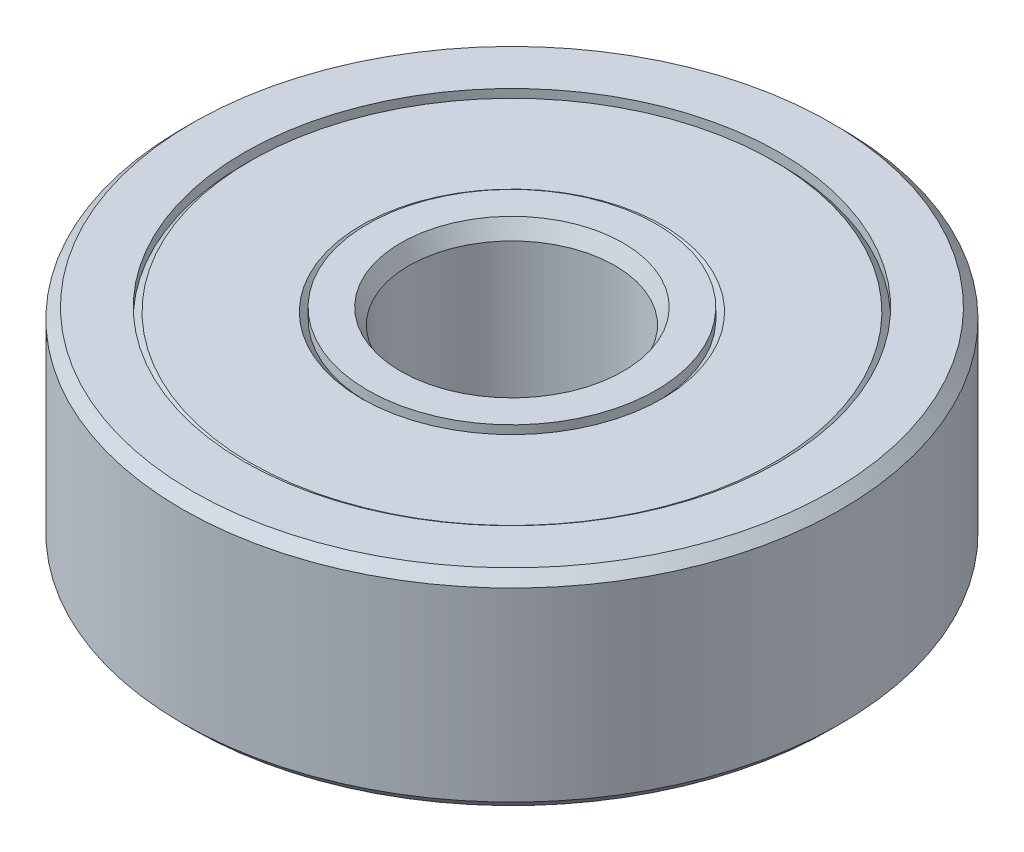
ISO-10303-21;
HEADER;
FILE_DESCRIPTION(('STEP AP214'),'2;1');
FILE_NAME('part.step','',(''),(''),'','','');
FILE_SCHEMA(('AUTOMOTIVE_DESIGN { 1 0 10303 214 1 1 1 1 }'));
ENDSEC;
DATA;
#1=APPLICATION_CONTEXT('core data for automotive mechanical design processes');
#2=APPLICATION_PROTOCOL_DEFINITION('international standard','automotive_design',2000,#1);
#3=PRODUCT_CONTEXT('',#1,'mechanical');
#4=PRODUCT('Part','Part','',(#3));
#5=PRODUCT_RELATED_PRODUCT_CATEGORY('part','',(#4));
#6=PRODUCT_DEFINITION_FORMATION('','',#4);
#7=PRODUCT_DEFINITION_CONTEXT('part definition',#1,'design');
#8=PRODUCT_DEFINITION('design','',#6,#7);
#9=PRODUCT_DEFINITION_SHAPE('','',#8);
#10=(LENGTH_UNIT() NAMED_UNIT(*) SI_UNIT(.MILLI.,.METRE.));
#11=(NAMED_UNIT(*) PLANE_ANGLE_UNIT() SI_UNIT($,.RADIAN.));
#12=(NAMED_UNIT(*) SI_UNIT($,.STERADIAN.) SOLID_ANGLE_UNIT());
#13=UNCERTAINTY_MEASURE_WITH_UNIT(LENGTH_MEASURE(1.E-05),#10,'distance_accuracy_value','');
#14=(GEOMETRIC_REPRESENTATION_CONTEXT(3) GLOBAL_UNCERTAINTY_ASSIGNED_CONTEXT((#13)) GLOBAL_UNIT_ASSIGNED_CONTEXT((#10,
#11,#12)) REPRESENTATION_CONTEXT('',''));
#15=CARTESIAN_POINT('',(0.,0.,0.));
#16=DIRECTION('',(0.,0.,1.));
#17=DIRECTION('',(1.,0.,0.));
#18=AXIS2_PLACEMENT_3D('',#15,#16,#17);
#19=CARTESIAN_POINT('',(0.,4.9,0.));
#20=DIRECTION('',(0.,-1.,0.));
#21=DIRECTION('',(0.,0.,-1.));
#22=AXIS2_PLACEMENT_3D('',#19,#20,#21);
#23=CYLINDRICAL_SURFACE('',#22,3.5);
#24=CARTESIAN_POINT('',(0.,0.250000000000004,0.));
#25=DIRECTION('',(0.,1.,0.));
#26=DIRECTION('',(0.,0.,1.));
#27=AXIS2_PLACEMENT_3D('',#24,#25,#26);
#28=CIRCLE('',#27,3.5);
#29=CARTESIAN_POINT('',(0.,0.250000000000004,3.5));
#30=VERTEX_POINT('',#29);
#31=EDGE_CURVE('E58',#30,#30,#28,.F.);
#32=ORIENTED_EDGE('',*,*,#31,.T.);
#33=EDGE_LOOP('',(#32));
#34=FACE_BOUND('',#33,.T.);
#35=CARTESIAN_POINT('',(0.,4.75,0.));
#36=DIRECTION('',(0.,1.,0.));
#37=DIRECTION('',(0.,0.,1.));
#38=AXIS2_PLACEMENT_3D('',#35,#36,#37);
#39=CIRCLE('',#38,3.5);
#40=CARTESIAN_POINT('',(0.,4.75,3.5));
#41=VERTEX_POINT('',#40);
#42=EDGE_CURVE('E62',#41,#41,#39,.T.);
#43=ORIENTED_EDGE('',*,*,#42,.T.);
#44=EDGE_LOOP('',(#43));
#45=FACE_BOUND('',#44,.T.);
#46=ADVANCED_FACE('F47',(#34,#45),#23,.F.);
#47=CARTESIAN_POINT('',(0.,4.9,0.));
#48=DIRECTION('',(0.,-1.,0.));
#49=DIRECTION('',(0.,0.,-1.));
#50=AXIS2_PLACEMENT_3D('',#47,#48,#49);
#51=CYLINDRICAL_SURFACE('',#50,6.5);
#52=CARTESIAN_POINT('',(0.,0.250000000000003,0.));
#53=DIRECTION('',(0.,1.,0.));
#54=DIRECTION('',(0.,0.,1.));
#55=AXIS2_PLACEMENT_3D('',#52,#53,#54);
#56=CIRCLE('',#55,6.5);
#57=CARTESIAN_POINT('',(0.,0.250000000000003,6.5));
#58=VERTEX_POINT('',#57);
#59=EDGE_CURVE('E73',#58,#58,#56,.T.);
#60=ORIENTED_EDGE('',*,*,#59,.T.);
#61=EDGE_LOOP('',(#60));
#62=FACE_BOUND('',#61,.T.);
#63=CARTESIAN_POINT('',(0.,4.75,0.));
#64=DIRECTION('',(0.,1.,0.));
#65=DIRECTION('',(0.,0.,1.));
#66=AXIS2_PLACEMENT_3D('',#63,#64,#65);
#67=CIRCLE('',#66,6.5);
#68=CARTESIAN_POINT('',(0.,4.75,6.5));
#69=VERTEX_POINT('',#68);
#70=EDGE_CURVE('E76',#69,#69,#67,.F.);
#71=ORIENTED_EDGE('',*,*,#70,.T.);
#72=EDGE_LOOP('',(#71));
#73=FACE_BOUND('',#72,.T.);
#74=ADVANCED_FACE('F80',(#62,#73),#51,.T.);
#75=CARTESIAN_POINT('',(0.,4.9,0.));
#76=DIRECTION('',(0.,1.,0.));
#77=DIRECTION('',(0.,0.,1.));
#78=AXIS2_PLACEMENT_3D('',#75,#76,#77);
#79=PLANE('',#78);
#80=CARTESIAN_POINT('',(0.,4.9,0.));
#81=DIRECTION('',(0.,1.,0.));
#82=DIRECTION('',(0.,0.,1.));
#83=AXIS2_PLACEMENT_3D('',#80,#81,#82);
#84=CIRCLE('',#83,6.35);
#85=CARTESIAN_POINT('',(0.,4.9,6.35));
#86=VERTEX_POINT('',#85);
#87=EDGE_CURVE('E12',#86,#86,#84,.T.);
#88=ORIENTED_EDGE('',*,*,#87,.T.);
#89=EDGE_LOOP('',(#88));
#90=FACE_BOUND('',#89,.T.);
#91=CARTESIAN_POINT('',(0.,4.9,0.));
#92=DIRECTION('',(0.,1.,0.));
#93=DIRECTION('',(0.,0.,1.));
#94=AXIS2_PLACEMENT_3D('',#91,#92,#93);
#95=CIRCLE('',#94,3.65);
#96=CARTESIAN_POINT('',(0.,4.9,3.65));
#97=VERTEX_POINT('',#96);
#98=EDGE_CURVE('E54',#97,#97,#95,.F.);
#99=ORIENTED_EDGE('',*,*,#98,.T.);
#100=EDGE_LOOP('',(#99));
#101=FACE_BOUND('',#100,.T.);
#102=ADVANCED_FACE('F100',(#90,#101),#79,.T.);
#103=CARTESIAN_POINT('',(0.,0.1,0.));
#104=DIRECTION('',(0.,1.,0.));
#105=DIRECTION('',(0.,0.,1.));
#106=AXIS2_PLACEMENT_3D('',#103,#104,#105);
#107=PLANE('',#106);
#108=CARTESIAN_POINT('',(0.,0.1,0.));
#109=DIRECTION('',(0.,1.,0.));
#110=DIRECTION('',(0.,0.,1.));
#111=AXIS2_PLACEMENT_3D('',#108,#109,#110);
#112=CIRCLE('',#111,6.35);
#113=CARTESIAN_POINT('',(0.,0.1,6.35));
#114=VERTEX_POINT('',#113);
#115=EDGE_CURVE('E67',#114,#114,#112,.F.);
#116=ORIENTED_EDGE('',*,*,#115,.T.);
#117=EDGE_LOOP('',(#116));
#118=FACE_BOUND('',#117,.T.);
#119=CARTESIAN_POINT('',(0.,0.1,0.));
#120=DIRECTION('',(0.,1.,0.));
#121=DIRECTION('',(0.,0.,1.));
#122=AXIS2_PLACEMENT_3D('',#119,#120,#121);
#123=CIRCLE('',#122,3.65);
#124=CARTESIAN_POINT('',(0.,0.1,3.65));
#125=VERTEX_POINT('',#124);
#126=EDGE_CURVE('E70',#125,#125,#123,.T.);
#127=ORIENTED_EDGE('',*,*,#126,.T.);
#128=EDGE_LOOP('',(#127));
#129=FACE_BOUND('',#128,.T.);
#130=ADVANCED_FACE('F107',(#118,#129),#107,.F.);
#131=CARTESIAN_POINT('',(0.,0.250000000000003,0.));
#132=DIRECTION('',(0.,1.,0.));
#133=DIRECTION('',(0.,0.,1.));
#134=AXIS2_PLACEMENT_3D('',#131,#132,#133);
#135=CONICAL_SURFACE('',#134,6.5,0.785398163397448);
#136=CARTESIAN_POINT('',(0.,0.1,6.35));
#137=CARTESIAN_POINT('',(0.,0.1015625,6.3515625));
#138=CARTESIAN_POINT('',(0.,0.103125,6.353125));
#139=CARTESIAN_POINT('',(0.,0.10625,6.35625));
#140=CARTESIAN_POINT('',(0.,0.1078125,6.3578125));
#141=CARTESIAN_POINT('',(0.,0.1109375,6.3609375));
#142=CARTESIAN_POINT('',(0.,0.1125,6.3625));
#143=CARTESIAN_POINT('',(0.,0.115625,6.365625));
#144=CARTESIAN_POINT('',(0.,0.1171875,6.3671875));
#145=CARTESIAN_POINT('',(0.,0.1203125,6.3703125));
#146=CARTESIAN_POINT('',(0.,0.121875,6.371875));
#147=CARTESIAN_POINT('',(0.,0.125,6.375));
#148=CARTESIAN_POINT('',(0.,0.126562500000001,6.3765625));
#149=CARTESIAN_POINT('',(0.,0.129687500000001,6.3796875));
#150=CARTESIAN_POINT('',(0.,0.13125,6.38125));
#151=CARTESIAN_POINT('',(0.,0.134375000000001,6.384375));
#152=CARTESIAN_POINT('',(0.,0.135937500000001,6.3859375));
#153=CARTESIAN_POINT('',(0.,0.139062500000001,6.3890625));
#154=CARTESIAN_POINT('',(0.,0.140625000000001,6.390625));
#155=CARTESIAN_POINT('',(0.,0.143750000000001,6.39375));
#156=CARTESIAN_POINT('',(0.,0.145312500000001,6.3953125));
#157=CARTESIAN_POINT('',(0.,0.148437500000001,6.3984375));
#158=CARTESIAN_POINT('',(0.,0.150000000000001,6.4));
#159=CARTESIAN_POINT('',(0.,0.153125000000001,6.403125));
#160=CARTESIAN_POINT('',(0.,0.154687500000001,6.4046875));
#161=CARTESIAN_POINT('',(0.,0.157812500000001,6.4078125));
#162=CARTESIAN_POINT('',(0.,0.159375000000001,6.409375));
#163=CARTESIAN_POINT('',(0.,0.162500000000001,6.4125));
#164=CARTESIAN_POINT('',(0.,0.164062500000001,6.4140625));
#165=CARTESIAN_POINT('',(0.,0.167187500000001,6.4171875));
#166=CARTESIAN_POINT('',(0.,0.168750000000001,6.41875));
#167=CARTESIAN_POINT('',(0.,0.171875000000001,6.421875));
#168=CARTESIAN_POINT('',(0.,0.173437500000001,6.4234375));
#169=CARTESIAN_POINT('',(0.,0.176562500000001,6.4265625));
#170=CARTESIAN_POINT('',(0.,0.178125000000001,6.428125));
#171=CARTESIAN_POINT('',(0.,0.181250000000001,6.43125));
#172=CARTESIAN_POINT('',(0.,0.182812500000002,6.4328125));
#173=CARTESIAN_POINT('',(0.,0.185937500000002,6.4359375));
#174=CARTESIAN_POINT('',(0.,0.187500000000002,6.4375));
#175=CARTESIAN_POINT('',(0.,0.190625000000002,6.440625));
#176=CARTESIAN_POINT('',(0.,0.192187500000002,6.4421875));
#177=CARTESIAN_POINT('',(0.,0.195312500000002,6.4453125));
#178=CARTESIAN_POINT('',(0.,0.196875000000002,6.446875));
#179=CARTESIAN_POINT('',(0.,0.200000000000002,6.45));
#180=CARTESIAN_POINT('',(0.,0.201562500000002,6.4515625));
#181=CARTESIAN_POINT('',(0.,0.204687500000002,6.4546875));
#182=CARTESIAN_POINT('',(0.,0.206250000000002,6.45625));
#183=CARTESIAN_POINT('',(0.,0.209375000000002,6.459375));
#184=CARTESIAN_POINT('',(0.,0.210937500000002,6.4609375));
#185=CARTESIAN_POINT('',(0.,0.214062500000002,6.4640625));
#186=CARTESIAN_POINT('',(0.,0.215625000000002,6.465625));
#187=CARTESIAN_POINT('',(0.,0.218750000000002,6.46875));
#188=CARTESIAN_POINT('',(0.,0.220312500000002,6.4703125));
#189=CARTESIAN_POINT('',(0.,0.223437500000002,6.4734375));
#190=CARTESIAN_POINT('',(0.,0.225000000000002,6.475));
#191=CARTESIAN_POINT('',(0.,0.228125000000002,6.478125));
#192=CARTESIAN_POINT('',(0.,0.229687500000002,6.4796875));
#193=CARTESIAN_POINT('',(0.,0.232812500000002,6.4828125));
#194=CARTESIAN_POINT('',(0.,0.234375000000003,6.484375));
#195=CARTESIAN_POINT('',(0.,0.237500000000003,6.4875));
#196=CARTESIAN_POINT('',(0.,0.239062500000003,6.4890625));
#197=CARTESIAN_POINT('',(0.,0.242187500000003,6.4921875));
#198=CARTESIAN_POINT('',(0.,0.243750000000003,6.49375));
#199=CARTESIAN_POINT('',(0.,0.246875000000003,6.496875));
#200=CARTESIAN_POINT('',(0.,0.248437500000003,6.4984375));
#201=CARTESIAN_POINT('',(0.,0.250000000000003,6.5));
#202=B_SPLINE_CURVE_WITH_KNOTS('',3,(#136,#137,#138,#139,#140,#141,#142,#143,#144,#145,#146,
#147,#148,#149,#150,#151,#152,#153,#154,#155,#156,#157,#158,#159,#160,#161,#162,#163,#164,#165,
#166,#167,#168,#169,#170,#171,#172,#173,#174,#175,#176,#177,#178,#179,#180,#181,#182,#183,#184,
#185,#186,#187,#188,#189,#190,#191,#192,#193,#194,#195,#196,#197,#198,#199,#200,#201),
.UNSPECIFIED.,.F.,.F.,(4,2,2,2,2,2,2,2,2,2,2,2,2,2,2,2,2,2,2,2,2,2,2,2,2,2,2,2,2,2,2,2,4),(0.,
0.00662912607362357,0.0132582521472478,0.019887378220872,0.0265165042944955,0.0331456303681197,
0.0397747564417439,0.0464038825153681,0.0530330085889917,0.0596621346626159,0.0662912607362401,
0.0729203868098637,0.0795495128834879,0.0861786389571121,0.0928077650307356,0.0994368911043598,
0.106066017177984,0.112695143251608,0.119324269325232,0.125953395398856,0.13258252147248,
0.139211647546104,0.145840773619728,0.152469899693352,0.159099025766976,0.1657281518406,
0.172357277914224,0.178986403987848,0.185615530061472,0.192244656135096,0.19887378220872,
0.205502908282344,0.212132034355968),.UNSPECIFIED.);
#203=EDGE_CURVE('BSEAM91',#114,#58,#202,.T.);
#204=ORIENTED_EDGE('',*,*,#115,.F.);
#205=ORIENTED_EDGE('',*,*,#59,.F.);
#206=ORIENTED_EDGE('',*,*,#203,.T.);
#207=ORIENTED_EDGE('',*,*,#203,.F.);
#208=EDGE_LOOP('',(#204,#206,#205,#207));
#209=FACE_BOUND('',#208,.T.);
#210=ADVANCED_FACE('F91',(#209),#135,.T.);
#211=CARTESIAN_POINT('',(0.,0.1,0.));
#212=DIRECTION('',(0.,-1.,0.));
#213=DIRECTION('',(0.,0.,-1.));
#214=AXIS2_PLACEMENT_3D('',#211,#212,#213);
#215=CONICAL_SURFACE('',#214,3.65,0.785398163397441);
#216=ORIENTED_EDGE('',*,*,#31,.F.);
#217=EDGE_LOOP('',(#216));
#218=FACE_BOUND('',#217,.T.);
#219=ORIENTED_EDGE('',*,*,#126,.F.);
#220=EDGE_LOOP('',(#219));
#221=FACE_BOUND('',#220,.T.);
#222=ADVANCED_FACE('F85',(#218,#221),#215,.F.);
#223=CARTESIAN_POINT('',(0.,4.9,0.));
#224=DIRECTION('',(0.,-1.,0.));
#225=DIRECTION('',(0.,0.,-1.));
#226=AXIS2_PLACEMENT_3D('',#223,#224,#225);
#227=CONICAL_SURFACE('',#226,6.35,0.785398163397451);
#228=ORIENTED_EDGE('',*,*,#70,.F.);
#229=EDGE_LOOP('',(#228));
#230=FACE_BOUND('',#229,.T.);
#231=ORIENTED_EDGE('',*,*,#87,.F.);
#232=EDGE_LOOP('',(#231));
#233=FACE_BOUND('',#232,.T.);
#234=ADVANCED_FACE('F82',(#230,#233),#227,.T.);
#235=CARTESIAN_POINT('',(0.,4.75,0.));
#236=DIRECTION('',(0.,1.,0.));
#237=DIRECTION('',(0.,0.,1.));
#238=AXIS2_PLACEMENT_3D('',#235,#236,#237);
#239=CONICAL_SURFACE('',#238,3.5,0.785398163397448);
#240=CARTESIAN_POINT('',(0.,4.9,3.65));
#241=CARTESIAN_POINT('',(0.,4.8984375,3.6484375));
#242=CARTESIAN_POINT('',(0.,4.896875,3.646875));
#243=CARTESIAN_POINT('',(0.,4.89375,3.64375));
#244=CARTESIAN_POINT('',(0.,4.8921875,3.6421875));
#245=CARTESIAN_POINT('',(0.,4.8890625,3.6390625));
#246=CARTESIAN_POINT('',(0.,4.8875,3.6375));
#247=CARTESIAN_POINT('',(0.,4.884375,3.634375));
#248=CARTESIAN_POINT('',(0.,4.8828125,3.6328125));
#249=CARTESIAN_POINT('',(0.,4.8796875,3.6296875));
#250=CARTESIAN_POINT('',(0.,4.878125,3.628125));
#251=CARTESIAN_POINT('',(0.,4.875,3.625));
#252=CARTESIAN_POINT('',(0.,4.8734375,3.6234375));
#253=CARTESIAN_POINT('',(0.,4.8703125,3.6203125));
#254=CARTESIAN_POINT('',(0.,4.86875,3.61875));
#255=CARTESIAN_POINT('',(0.,4.865625,3.615625));
#256=CARTESIAN_POINT('',(0.,4.8640625,3.6140625));
#257=CARTESIAN_POINT('',(0.,4.8609375,3.6109375));
#258=CARTESIAN_POINT('',(0.,4.859375,3.609375));
#259=CARTESIAN_POINT('',(0.,4.85625,3.60625));
#260=CARTESIAN_POINT('',(0.,4.8546875,3.6046875));
#261=CARTESIAN_POINT('',(0.,4.8515625,3.6015625));
#262=CARTESIAN_POINT('',(0.,4.85,3.6));
#263=CARTESIAN_POINT('',(0.,4.846875,3.596875));
#264=CARTESIAN_POINT('',(0.,4.8453125,3.5953125));
#265=CARTESIAN_POINT('',(0.,4.8421875,3.5921875));
#266=CARTESIAN_POINT('',(0.,4.840625,3.590625));
#267=CARTESIAN_POINT('',(0.,4.8375,3.5875));
#268=CARTESIAN_POINT('',(0.,4.8359375,3.5859375));
#269=CARTESIAN_POINT('',(0.,4.8328125,3.5828125));
#270=CARTESIAN_POINT('',(0.,4.83125,3.58125));
#271=CARTESIAN_POINT('',(0.,4.828125,3.578125));
#272=CARTESIAN_POINT('',(0.,4.8265625,3.5765625));
#273=CARTESIAN_POINT('',(0.,4.8234375,3.5734375));
#274=CARTESIAN_POINT('',(0.,4.821875,3.571875));
#275=CARTESIAN_POINT('',(0.,4.81875,3.56875));
#276=CARTESIAN_POINT('',(0.,4.8171875,3.5671875));
#277=CARTESIAN_POINT('',(0.,4.8140625,3.5640625));
#278=CARTESIAN_POINT('',(0.,4.8125,3.5625));
#279=CARTESIAN_POINT('',(0.,4.809375,3.559375));
#280=CARTESIAN_POINT('',(0.,4.8078125,3.5578125));
#281=CARTESIAN_POINT('',(0.,4.8046875,3.5546875));
#282=CARTESIAN_POINT('',(0.,4.803125,3.553125));
#283=CARTESIAN_POINT('',(0.,4.8,3.55));
#284=CARTESIAN_POINT('',(0.,4.7984375,3.5484375));
#285=CARTESIAN_POINT('',(0.,4.7953125,3.5453125));
#286=CARTESIAN_POINT('',(0.,4.79375,3.54375));
#287=CARTESIAN_POINT('',(0.,4.790625,3.540625));
#288=CARTESIAN_POINT('',(0.,4.7890625,3.5390625));
#289=CARTESIAN_POINT('',(0.,4.7859375,3.5359375));
#290=CARTESIAN_POINT('',(0.,4.784375,3.534375));
#291=CARTESIAN_POINT('',(0.,4.78125,3.53125));
#292=CARTESIAN_POINT('',(0.,4.7796875,3.5296875));
#293=CARTESIAN_POINT('',(0.,4.7765625,3.5265625));
#294=CARTESIAN_POINT('',(0.,4.775,3.525));
#295=CARTESIAN_POINT('',(0.,4.771875,3.521875));
#296=CARTESIAN_POINT('',(0.,4.7703125,3.5203125));
#297=CARTESIAN_POINT('',(0.,4.7671875,3.5171875));
#298=CARTESIAN_POINT('',(0.,4.765625,3.515625));
#299=CARTESIAN_POINT('',(0.,4.7625,3.5125));
#300=CARTESIAN_POINT('',(0.,4.7609375,3.5109375));
#301=CARTESIAN_POINT('',(0.,4.7578125,3.5078125));
#302=CARTESIAN_POINT('',(0.,4.75625,3.50625));
#303=CARTESIAN_POINT('',(0.,4.753125,3.503125));
#304=CARTESIAN_POINT('',(0.,4.7515625,3.5015625));
#305=CARTESIAN_POINT('',(0.,4.75,3.5));
#306=B_SPLINE_CURVE_WITH_KNOTS('',3,(#240,#241,#242,#243,#244,#245,#246,#247,#248,#249,#250,
#251,#252,#253,#254,#255,#256,#257,#258,#259,#260,#261,#262,#263,#264,#265,#266,#267,#268,#269,
#270,#271,#272,#273,#274,#275,#276,#277,#278,#279,#280,#281,#282,#283,#284,#285,#286,#287,#288,
#289,#290,#291,#292,#293,#294,#295,#296,#297,#298,#299,#300,#301,#302,#303,#304,#305),
.UNSPECIFIED.,.F.,.F.,(4,2,2,2,2,2,2,2,2,2,2,2,2,2,2,2,2,2,2,2,2,2,2,2,2,2,2,2,2,2,2,2,4),(0.,
0.00662912607362346,0.0132582521472478,0.0198873782208719,0.0265165042944954,0.0331456303681198,
0.0397747564417438,0.0464038825153676,0.0530330085889917,0.0596621346626157,0.0662912607362395,
0.0729203868098636,0.079549512883488,0.0861786389571114,0.0928077650307355,0.0994368911043599,
0.106066017177984,0.112695143251607,0.119324269325232,0.125953395398856,0.132582521472479,
0.139211647546104,0.145840773619728,0.152469899693352,0.159099025766976,0.1657281518406,
0.172357277914223,0.178986403987848,0.185615530061472,0.192244656135095,0.198873782208719,
0.205502908282344,0.212132034355967),.UNSPECIFIED.);
#307=EDGE_CURVE('BSEAM49',#97,#41,#306,.T.);
#308=ORIENTED_EDGE('',*,*,#98,.F.);
#309=ORIENTED_EDGE('',*,*,#42,.F.);
#310=ORIENTED_EDGE('',*,*,#307,.T.);
#311=ORIENTED_EDGE('',*,*,#307,.F.);
#312=EDGE_LOOP('',(#308,#310,#309,#311));
#313=FACE_BOUND('',#312,.T.);
#314=ADVANCED_FACE('F49',(#313),#239,.F.);
#315=CLOSED_SHELL('',(#46,#74,#102,#130,#210,#222,#234,#314));
#316=MANIFOLD_SOLID_BREP('B2',#315);
#317=CARTESIAN_POINT('',(0.,5.,0.));
#318=DIRECTION('',(0.,-1.,0.));
#319=DIRECTION('',(0.,0.,-1.));
#320=AXIS2_PLACEMENT_3D('',#317,#318,#319);
#321=CYLINDRICAL_SURFACE('',#320,6.5);
#322=CARTESIAN_POINT('',(0.,5.,0.));
#323=DIRECTION('',(0.,1.,0.));
#324=DIRECTION('',(0.,0.,1.));
#325=AXIS2_PLACEMENT_3D('',#322,#323,#324);
#326=CIRCLE('',#325,6.5);
#327=CARTESIAN_POINT('',(0.,5.,6.5));
#328=VERTEX_POINT('',#327);
#329=EDGE_CURVE('E195',#328,#328,#326,.T.);
#330=ORIENTED_EDGE('',*,*,#329,.T.);
#331=EDGE_LOOP('',(#330));
#332=FACE_BOUND('',#331,.T.);
#333=CARTESIAN_POINT('',(0.,0.,0.));
#334=DIRECTION('',(0.,1.,0.));
#335=DIRECTION('',(0.,0.,1.));
#336=AXIS2_PLACEMENT_3D('',#333,#334,#335);
#337=CIRCLE('',#336,6.5);
#338=CARTESIAN_POINT('',(0.,0.,6.5));
#339=VERTEX_POINT('',#338);
#340=EDGE_CURVE('E196',#339,#339,#337,.T.);
#341=ORIENTED_EDGE('',*,*,#340,.F.);
#342=EDGE_LOOP('',(#341));
#343=FACE_BOUND('',#342,.T.);
#344=ADVANCED_FACE('F175',(#332,#343),#321,.F.);
#345=CARTESIAN_POINT('',(0.,5.,0.));
#346=DIRECTION('',(0.,-1.,0.));
#347=DIRECTION('',(0.,0.,-1.));
#348=AXIS2_PLACEMENT_3D('',#345,#346,#347);
#349=CYLINDRICAL_SURFACE('',#348,8.);
#350=CARTESIAN_POINT('',(0.,0.250000000000002,0.));
#351=DIRECTION('',(0.,1.,0.));
#352=DIRECTION('',(0.,0.,1.));
#353=AXIS2_PLACEMENT_3D('',#350,#351,#352);
#354=CIRCLE('',#353,8.);
#355=CARTESIAN_POINT('',(0.,0.250000000000002,8.));
#356=VERTEX_POINT('',#355);
#357=EDGE_CURVE('E186',#356,#356,#354,.T.);
#358=ORIENTED_EDGE('',*,*,#357,.T.);
#359=EDGE_LOOP('',(#358));
#360=FACE_BOUND('',#359,.T.);
#361=CARTESIAN_POINT('',(0.,4.75,0.));
#362=DIRECTION('',(0.,1.,0.));
#363=DIRECTION('',(0.,0.,1.));
#364=AXIS2_PLACEMENT_3D('',#361,#362,#363);
#365=CIRCLE('',#364,8.);
#366=CARTESIAN_POINT('',(0.,4.75,8.));
#367=VERTEX_POINT('',#366);
#368=EDGE_CURVE('E190',#367,#367,#365,.F.);
#369=ORIENTED_EDGE('',*,*,#368,.T.);
#370=EDGE_LOOP('',(#369));
#371=FACE_BOUND('',#370,.T.);
#372=ADVANCED_FACE('F207',(#360,#371),#349,.T.);
#373=CARTESIAN_POINT('',(0.,5.,0.));
#374=DIRECTION('',(0.,1.,0.));
#375=DIRECTION('',(0.,0.,1.));
#376=AXIS2_PLACEMENT_3D('',#373,#374,#375);
#377=PLANE('',#376);
#378=CARTESIAN_POINT('',(0.,5.,0.));
#379=DIRECTION('',(0.,1.,0.));
#380=DIRECTION('',(0.,0.,1.));
#381=AXIS2_PLACEMENT_3D('',#378,#379,#380);
#382=CIRCLE('',#381,7.75);
#383=CARTESIAN_POINT('',(0.,5.,7.75));
#384=VERTEX_POINT('',#383);
#385=EDGE_CURVE('E46',#384,#384,#382,.T.);
#386=ORIENTED_EDGE('',*,*,#385,.T.);
#387=EDGE_LOOP('',(#386));
#388=FACE_BOUND('',#387,.T.);
#389=ORIENTED_EDGE('',*,*,#329,.F.);
#390=EDGE_LOOP('',(#389));
#391=FACE_BOUND('',#390,.T.);
#392=ADVANCED_FACE('F204',(#388,#391),#377,.T.);
#393=CARTESIAN_POINT('',(0.,0.,0.));
#394=DIRECTION('',(0.,1.,0.));
#395=DIRECTION('',(0.,0.,1.));
#396=AXIS2_PLACEMENT_3D('',#393,#394,#395);
#397=PLANE('',#396);
#398=CARTESIAN_POINT('',(0.,0.,0.));
#399=DIRECTION('',(0.,1.,0.));
#400=DIRECTION('',(0.,0.,1.));
#401=AXIS2_PLACEMENT_3D('',#398,#399,#400);
#402=CIRCLE('',#401,7.75);
#403=CARTESIAN_POINT('',(0.,0.,7.75));
#404=VERTEX_POINT('',#403);
#405=EDGE_CURVE('E182',#404,#404,#402,.F.);
#406=ORIENTED_EDGE('',*,*,#405,.T.);
#407=EDGE_LOOP('',(#406));
#408=FACE_BOUND('',#407,.T.);
#409=ORIENTED_EDGE('',*,*,#340,.T.);
#410=EDGE_LOOP('',(#409));
#411=FACE_BOUND('',#410,.T.);
#412=ADVANCED_FACE('F206',(#408,#411),#397,.F.);
#413=CARTESIAN_POINT('',(0.,0.250000000000002,0.));
#414=DIRECTION('',(0.,1.,0.));
#415=DIRECTION('',(0.,0.,1.));
#416=AXIS2_PLACEMENT_3D('',#413,#414,#415);
#417=CONICAL_SURFACE('',#416,8.,0.785398163397448);
#418=ORIENTED_EDGE('',*,*,#405,.F.);
#419=EDGE_LOOP('',(#418));
#420=FACE_BOUND('',#419,.T.);
#421=ORIENTED_EDGE('',*,*,#357,.F.);
#422=EDGE_LOOP('',(#421));
#423=FACE_BOUND('',#422,.T.);
#424=ADVANCED_FACE('F213',(#420,#423),#417,.T.);
#425=CARTESIAN_POINT('',(0.,5.,0.));
#426=DIRECTION('',(0.,-1.,0.));
#427=DIRECTION('',(0.,0.,-1.));
#428=AXIS2_PLACEMENT_3D('',#425,#426,#427);
#429=CONICAL_SURFACE('',#428,7.75,0.785398163397441);
#430=ORIENTED_EDGE('',*,*,#368,.F.);
#431=EDGE_LOOP('',(#430));
#432=FACE_BOUND('',#431,.T.);
#433=ORIENTED_EDGE('',*,*,#385,.F.);
#434=EDGE_LOOP('',(#433));
#435=FACE_BOUND('',#434,.T.);
#436=ADVANCED_FACE('F177',(#432,#435),#429,.T.);
#437=CLOSED_SHELL('',(#344,#372,#392,#412,#424,#436));
#438=MANIFOLD_SOLID_BREP('B7',#437);
#439=CARTESIAN_POINT('',(0.,5.,0.));
#440=DIRECTION('',(0.,-1.,0.));
#441=DIRECTION('',(0.,0.,-1.));
#442=AXIS2_PLACEMENT_3D('',#439,#440,#441);
#443=CYLINDRICAL_SURFACE('',#442,2.5);
#444=CARTESIAN_POINT('',(0.,0.376145293069265,0.));
#445=DIRECTION('',(0.,1.,0.));
#446=DIRECTION('',(0.,0.,1.));
#447=AXIS2_PLACEMENT_3D('',#444,#445,#446);
#448=CIRCLE('',#447,2.5);
#449=CARTESIAN_POINT('',(0.,0.376145293069265,2.5));
#450=VERTEX_POINT('',#449);
#451=EDGE_CURVE('E174',#450,#450,#448,.F.);
#452=ORIENTED_EDGE('',*,*,#451,.T.);
#453=EDGE_LOOP('',(#452));
#454=FACE_BOUND('',#453,.T.);
#455=CARTESIAN_POINT('',(0.,4.62385470693073,0.));
#456=DIRECTION('',(0.,1.,0.));
#457=DIRECTION('',(0.,0.,1.));
#458=AXIS2_PLACEMENT_3D('',#455,#456,#457);
#459=CIRCLE('',#458,2.5);
#460=CARTESIAN_POINT('',(0.,4.62385470693073,2.5));
#461=VERTEX_POINT('',#460);
#462=EDGE_CURVE('E281',#461,#461,#459,.T.);
#463=ORIENTED_EDGE('',*,*,#462,.T.);
#464=EDGE_LOOP('',(#463));
#465=FACE_BOUND('',#464,.T.);
#466=ADVANCED_FACE('F266',(#454,#465),#443,.F.);
#467=CARTESIAN_POINT('',(0.,5.,0.));
#468=DIRECTION('',(0.,-1.,0.));
#469=DIRECTION('',(0.,0.,-1.));
#470=AXIS2_PLACEMENT_3D('',#467,#468,#469);
#471=CYLINDRICAL_SURFACE('',#470,3.5);
#472=CARTESIAN_POINT('',(0.,5.,0.));
#473=DIRECTION('',(0.,1.,0.));
#474=DIRECTION('',(0.,0.,1.));
#475=AXIS2_PLACEMENT_3D('',#472,#473,#474);
#476=CIRCLE('',#475,3.5);
#477=CARTESIAN_POINT('',(0.,5.,3.5));
#478=VERTEX_POINT('',#477);
#479=EDGE_CURVE('E286',#478,#478,#476,.T.);
#480=ORIENTED_EDGE('',*,*,#479,.F.);
#481=EDGE_LOOP('',(#480));
#482=FACE_BOUND('',#481,.T.);
#483=CARTESIAN_POINT('',(0.,0.,0.));
#484=DIRECTION('',(0.,1.,0.));
#485=DIRECTION('',(0.,0.,1.));
#486=AXIS2_PLACEMENT_3D('',#483,#484,#485);
#487=CIRCLE('',#486,3.5);
#488=CARTESIAN_POINT('',(0.,0.,3.5));
#489=VERTEX_POINT('',#488);
#490=EDGE_CURVE('E287',#489,#489,#487,.T.);
#491=ORIENTED_EDGE('',*,*,#490,.T.);
#492=EDGE_LOOP('',(#491));
#493=FACE_BOUND('',#492,.T.);
#494=ADVANCED_FACE('F295',(#482,#493),#471,.T.);
#495=CARTESIAN_POINT('',(0.,5.,0.));
#496=DIRECTION('',(0.,1.,0.));
#497=DIRECTION('',(0.,0.,1.));
#498=AXIS2_PLACEMENT_3D('',#495,#496,#497);
#499=PLANE('',#498);
#500=CARTESIAN_POINT('',(0.,5.,0.));
#501=DIRECTION('',(0.,1.,0.));
#502=DIRECTION('',(0.,0.,1.));
#503=AXIS2_PLACEMENT_3D('',#500,#501,#502);
#504=CIRCLE('',#503,2.7);
#505=CARTESIAN_POINT('',(0.,5.,2.7));
#506=VERTEX_POINT('',#505);
#507=EDGE_CURVE('E277',#506,#506,#504,.F.);
#508=ORIENTED_EDGE('',*,*,#507,.T.);
#509=EDGE_LOOP('',(#508));
#510=FACE_BOUND('',#509,.T.);
#511=ORIENTED_EDGE('',*,*,#479,.T.);
#512=EDGE_LOOP('',(#511));
#513=FACE_BOUND('',#512,.T.);
#514=ADVANCED_FACE('F293',(#510,#513),#499,.T.);
#515=CARTESIAN_POINT('',(0.,0.,0.));
#516=DIRECTION('',(0.,1.,0.));
#517=DIRECTION('',(0.,0.,1.));
#518=AXIS2_PLACEMENT_3D('',#515,#516,#517);
#519=PLANE('',#518);
#520=CARTESIAN_POINT('',(0.,0.,0.));
#521=DIRECTION('',(0.,1.,0.));
#522=DIRECTION('',(0.,0.,1.));
#523=AXIS2_PLACEMENT_3D('',#520,#521,#522);
#524=CIRCLE('',#523,2.7);
#525=CARTESIAN_POINT('',(0.,0.,2.7));
#526=VERTEX_POINT('',#525);
#527=EDGE_CURVE('E273',#526,#526,#524,.T.);
#528=ORIENTED_EDGE('',*,*,#527,.T.);
#529=EDGE_LOOP('',(#528));
#530=FACE_BOUND('',#529,.T.);
#531=ORIENTED_EDGE('',*,*,#490,.F.);
#532=EDGE_LOOP('',(#531));
#533=FACE_BOUND('',#532,.T.);
#534=ADVANCED_FACE('F301',(#530,#533),#519,.F.);
#535=CARTESIAN_POINT('',(0.,4.62385470693073,0.));
#536=DIRECTION('',(0.,1.,0.));
#537=DIRECTION('',(0.,0.,1.));
#538=AXIS2_PLACEMENT_3D('',#535,#536,#537);
#539=CONICAL_SURFACE('',#538,2.5,0.488692190558414);
#540=ORIENTED_EDGE('',*,*,#507,.F.);
#541=EDGE_LOOP('',(#540));
#542=FACE_BOUND('',#541,.T.);
#543=ORIENTED_EDGE('',*,*,#462,.F.);
#544=EDGE_LOOP('',(#543));
#545=FACE_BOUND('',#544,.T.);
#546=ADVANCED_FACE('F303',(#542,#545),#539,.F.);
#547=CARTESIAN_POINT('',(0.,0.,0.));
#548=DIRECTION('',(0.,-1.,0.));
#549=DIRECTION('',(0.,0.,-1.));
#550=AXIS2_PLACEMENT_3D('',#547,#548,#549);
#551=CONICAL_SURFACE('',#550,2.7,0.488692190558414);
#552=ORIENTED_EDGE('',*,*,#451,.F.);
#553=EDGE_LOOP('',(#552));
#554=FACE_BOUND('',#553,.T.);
#555=ORIENTED_EDGE('',*,*,#527,.F.);
#556=EDGE_LOOP('',(#555));
#557=FACE_BOUND('',#556,.T.);
#558=ADVANCED_FACE('F268',(#554,#557),#551,.F.);
#559=CLOSED_SHELL('',(#466,#494,#514,#534,#546,#558));
#560=MANIFOLD_SOLID_BREP('B41',#559);
#561=ADVANCED_BREP_SHAPE_REPRESENTATION('',(#18,#316,#438,#560),#14);
#562=SHAPE_DEFINITION_REPRESENTATION(#9,#561);
ENDSEC;
END-ISO-10303-21;
